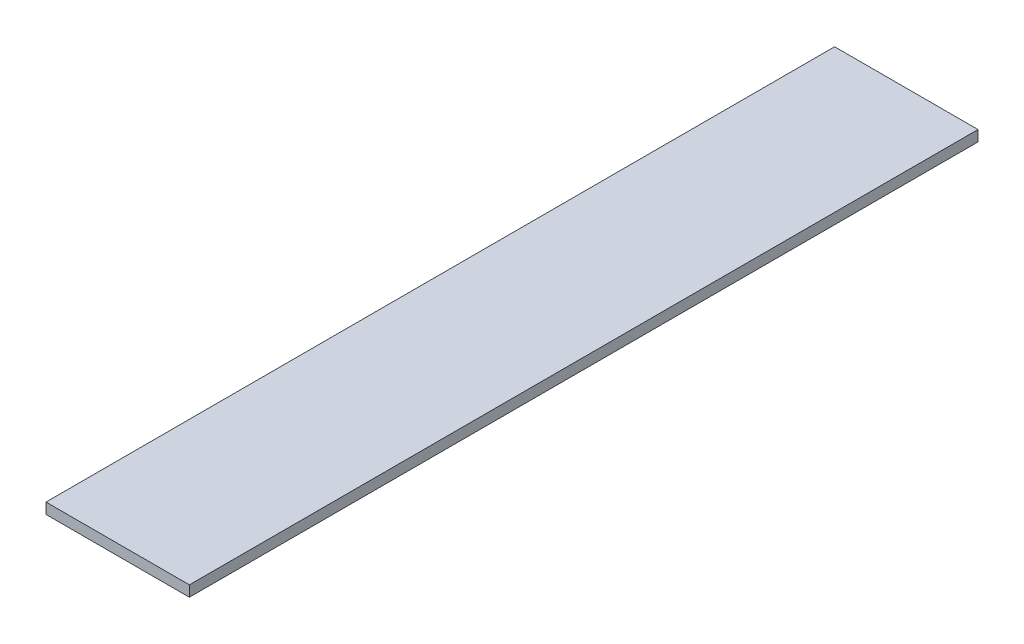
ISO-10303-21;
HEADER;
FILE_DESCRIPTION(('STEP AP214'),'2;1');
FILE_NAME('part.step','',(''),(''),'','','');
FILE_SCHEMA(('AUTOMOTIVE_DESIGN { 1 0 10303 214 1 1 1 1 }'));
ENDSEC;
DATA;
#1=APPLICATION_CONTEXT('core data for automotive mechanical design processes');
#2=APPLICATION_PROTOCOL_DEFINITION('international standard','automotive_design',2000,#1);
#3=PRODUCT_CONTEXT('',#1,'mechanical');
#4=PRODUCT('Part','Part','',(#3));
#5=PRODUCT_RELATED_PRODUCT_CATEGORY('part','',(#4));
#6=PRODUCT_DEFINITION_FORMATION('','',#4);
#7=PRODUCT_DEFINITION_CONTEXT('part definition',#1,'design');
#8=PRODUCT_DEFINITION('design','',#6,#7);
#9=PRODUCT_DEFINITION_SHAPE('','',#8);
#10=(LENGTH_UNIT() NAMED_UNIT(*) SI_UNIT(.MILLI.,.METRE.));
#11=(NAMED_UNIT(*) PLANE_ANGLE_UNIT() SI_UNIT($,.RADIAN.));
#12=(NAMED_UNIT(*) SI_UNIT($,.STERADIAN.) SOLID_ANGLE_UNIT());
#13=UNCERTAINTY_MEASURE_WITH_UNIT(LENGTH_MEASURE(1.E-05),#10,'distance_accuracy_value','');
#14=(GEOMETRIC_REPRESENTATION_CONTEXT(3) GLOBAL_UNCERTAINTY_ASSIGNED_CONTEXT((#13)) GLOBAL_UNIT_ASSIGNED_CONTEXT((#10,
#11,#12)) REPRESENTATION_CONTEXT('',''));
#15=CARTESIAN_POINT('',(0.,0.,0.));
#16=DIRECTION('',(0.,0.,1.));
#17=DIRECTION('',(1.,0.,0.));
#18=AXIS2_PLACEMENT_3D('',#15,#16,#17);
#19=CARTESIAN_POINT('',(330.,597.,-790.));
#20=DIRECTION('',(-1.,0.,0.));
#21=DIRECTION('',(0.,0.,1.));
#22=AXIS2_PLACEMENT_3D('',#19,#20,#21);
#23=PLANE('',#22);
#24=DIRECTION('',(0.,-1.,0.));
#25=VECTOR('',#24,1.);
#26=CARTESIAN_POINT('',(330.,597.,-570.));
#27=LINE('',#26,#25);
#28=CARTESIAN_POINT('',(330.,600.,-570.));
#29=VERTEX_POINT('',#28);
#30=CARTESIAN_POINT('',(330.,597.,-570.));
#31=VERTEX_POINT('',#30);
#32=EDGE_CURVE('E103',#29,#31,#27,.T.);
#33=ORIENTED_EDGE('',*,*,#32,.F.);
#34=DIRECTION('',(0.,0.,1.));
#35=VECTOR('',#34,1.);
#36=CARTESIAN_POINT('',(330.,600.,-790.));
#37=LINE('',#36,#35);
#38=CARTESIAN_POINT('',(330.,600.,-790.));
#39=VERTEX_POINT('',#38);
#40=EDGE_CURVE('E11',#39,#29,#37,.T.);
#41=ORIENTED_EDGE('',*,*,#40,.F.);
#42=DIRECTION('',(0.,-1.,0.));
#43=VECTOR('',#42,1.);
#44=CARTESIAN_POINT('',(330.,597.,-790.));
#45=LINE('',#44,#43);
#46=CARTESIAN_POINT('',(330.,597.,-790.));
#47=VERTEX_POINT('',#46);
#48=EDGE_CURVE('E97',#39,#47,#45,.T.);
#49=ORIENTED_EDGE('',*,*,#48,.T.);
#50=DIRECTION('',(0.,0.,1.));
#51=VECTOR('',#50,1.);
#52=CARTESIAN_POINT('',(330.,597.,-790.));
#53=LINE('',#52,#51);
#54=EDGE_CURVE('E42',#47,#31,#53,.T.);
#55=ORIENTED_EDGE('',*,*,#54,.T.);
#56=EDGE_LOOP('',(#33,#41,#49,#55));
#57=FACE_BOUND('',#56,.T.);
#58=ADVANCED_FACE('F39',(#57),#23,.T.);
#59=CARTESIAN_POINT('',(330.,600.,-790.));
#60=DIRECTION('',(0.,1.,0.));
#61=DIRECTION('',(0.,0.,1.));
#62=AXIS2_PLACEMENT_3D('',#59,#60,#61);
#63=PLANE('',#62);
#64=DIRECTION('',(-1.,0.,0.));
#65=VECTOR('',#64,1.);
#66=CARTESIAN_POINT('',(330.,600.,-570.));
#67=LINE('',#66,#65);
#68=CARTESIAN_POINT('',(370.,600.,-570.));
#69=VERTEX_POINT('',#68);
#70=EDGE_CURVE('E99',#69,#29,#67,.T.);
#71=ORIENTED_EDGE('',*,*,#70,.F.);
#72=DIRECTION('',(0.,0.,1.));
#73=VECTOR('',#72,1.);
#74=CARTESIAN_POINT('',(370.,600.,-790.));
#75=LINE('',#74,#73);
#76=CARTESIAN_POINT('',(370.,600.,-790.));
#77=VERTEX_POINT('',#76);
#78=EDGE_CURVE('E48',#77,#69,#75,.T.);
#79=ORIENTED_EDGE('',*,*,#78,.F.);
#80=DIRECTION('',(-1.,0.,0.));
#81=VECTOR('',#80,1.);
#82=CARTESIAN_POINT('',(330.,600.,-790.));
#83=LINE('',#82,#81);
#84=EDGE_CURVE('E94',#77,#39,#83,.T.);
#85=ORIENTED_EDGE('',*,*,#84,.T.);
#86=ORIENTED_EDGE('',*,*,#40,.T.);
#87=EDGE_LOOP('',(#71,#79,#85,#86));
#88=FACE_BOUND('',#87,.T.);
#89=ADVANCED_FACE('F113',(#88),#63,.T.);
#90=CARTESIAN_POINT('',(370.,597.,-790.));
#91=DIRECTION('',(1.,0.,0.));
#92=DIRECTION('',(0.,0.,-1.));
#93=AXIS2_PLACEMENT_3D('',#90,#91,#92);
#94=PLANE('',#93);
#95=DIRECTION('',(0.,1.,0.));
#96=VECTOR('',#95,1.);
#97=CARTESIAN_POINT('',(370.,597.,-570.));
#98=LINE('',#97,#96);
#99=CARTESIAN_POINT('',(370.,597.,-570.));
#100=VERTEX_POINT('',#99);
#101=EDGE_CURVE('E89',#100,#69,#98,.T.);
#102=ORIENTED_EDGE('',*,*,#101,.F.);
#103=DIRECTION('',(0.,0.,1.));
#104=VECTOR('',#103,1.);
#105=CARTESIAN_POINT('',(370.,597.,-790.));
#106=LINE('',#105,#104);
#107=CARTESIAN_POINT('',(370.,597.,-790.));
#108=VERTEX_POINT('',#107);
#109=EDGE_CURVE('E84',#108,#100,#106,.T.);
#110=ORIENTED_EDGE('',*,*,#109,.F.);
#111=DIRECTION('',(0.,1.,0.));
#112=VECTOR('',#111,1.);
#113=CARTESIAN_POINT('',(370.,597.,-790.));
#114=LINE('',#113,#112);
#115=EDGE_CURVE('E87',#108,#77,#114,.T.);
#116=ORIENTED_EDGE('',*,*,#115,.T.);
#117=ORIENTED_EDGE('',*,*,#78,.T.);
#118=EDGE_LOOP('',(#102,#110,#116,#117));
#119=FACE_BOUND('',#118,.T.);
#120=ADVANCED_FACE('F86',(#119),#94,.T.);
#121=CARTESIAN_POINT('',(330.,597.,-790.));
#122=DIRECTION('',(0.,-1.,0.));
#123=DIRECTION('',(0.,0.,-1.));
#124=AXIS2_PLACEMENT_3D('',#121,#122,#123);
#125=PLANE('',#124);
#126=DIRECTION('',(1.,0.,0.));
#127=VECTOR('',#126,1.);
#128=CARTESIAN_POINT('',(330.,597.,-570.));
#129=LINE('',#128,#127);
#130=EDGE_CURVE('E106',#31,#100,#129,.T.);
#131=ORIENTED_EDGE('',*,*,#130,.F.);
#132=ORIENTED_EDGE('',*,*,#54,.F.);
#133=DIRECTION('',(1.,0.,0.));
#134=VECTOR('',#133,1.);
#135=CARTESIAN_POINT('',(330.,597.,-790.));
#136=LINE('',#135,#134);
#137=EDGE_CURVE('E93',#47,#108,#136,.T.);
#138=ORIENTED_EDGE('',*,*,#137,.T.);
#139=ORIENTED_EDGE('',*,*,#109,.T.);
#140=EDGE_LOOP('',(#131,#132,#138,#139));
#141=FACE_BOUND('',#140,.T.);
#142=ADVANCED_FACE('F96',(#141),#125,.T.);
#143=CARTESIAN_POINT('',(0.,0.,-790.));
#144=DIRECTION('',(0.,0.,-1.));
#145=DIRECTION('',(-1.,0.,0.));
#146=AXIS2_PLACEMENT_3D('',#143,#144,#145);
#147=PLANE('',#146);
#148=ORIENTED_EDGE('',*,*,#48,.F.);
#149=ORIENTED_EDGE('',*,*,#84,.F.);
#150=ORIENTED_EDGE('',*,*,#115,.F.);
#151=ORIENTED_EDGE('',*,*,#137,.F.);
#152=EDGE_LOOP('',(#148,#149,#150,#151));
#153=FACE_BOUND('',#152,.T.);
#154=ADVANCED_FACE('F92',(#153),#147,.T.);
#155=CARTESIAN_POINT('',(0.,0.,-570.));
#156=DIRECTION('',(0.,0.,-1.));
#157=DIRECTION('',(-1.,0.,0.));
#158=AXIS2_PLACEMENT_3D('',#155,#156,#157);
#159=PLANE('',#158);
#160=ORIENTED_EDGE('',*,*,#32,.T.);
#161=ORIENTED_EDGE('',*,*,#130,.T.);
#162=ORIENTED_EDGE('',*,*,#101,.T.);
#163=ORIENTED_EDGE('',*,*,#70,.T.);
#164=EDGE_LOOP('',(#160,#161,#162,#163));
#165=FACE_BOUND('',#164,.T.);
#166=ADVANCED_FACE('F112',(#165),#159,.F.);
#167=CLOSED_SHELL('',(#58,#89,#120,#142,#154,#166));
#168=MANIFOLD_SOLID_BREP('B2',#167);
#169=ADVANCED_BREP_SHAPE_REPRESENTATION('',(#18,#168),#14);
#170=SHAPE_DEFINITION_REPRESENTATION(#9,#169);
ENDSEC;
END-ISO-10303-21;
